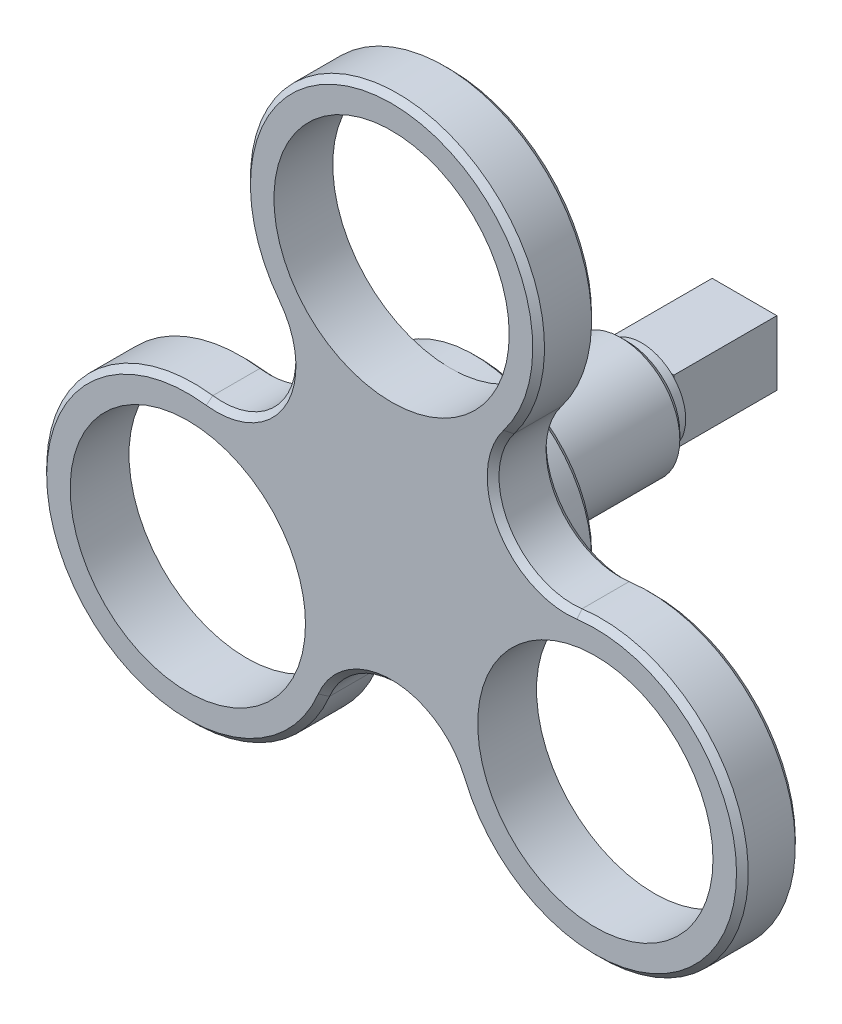
ISO-10303-21;
HEADER;
FILE_DESCRIPTION(('STEP AP214'),'2;1');
FILE_NAME('part.step','',(''),(''),'','','');
FILE_SCHEMA(('AUTOMOTIVE_DESIGN { 1 0 10303 214 1 1 1 1 }'));
ENDSEC;
DATA;
#1=APPLICATION_CONTEXT('core data for automotive mechanical design processes');
#2=APPLICATION_PROTOCOL_DEFINITION('international standard','automotive_design',2000,#1);
#3=PRODUCT_CONTEXT('',#1,'mechanical');
#4=PRODUCT('Part','Part','',(#3));
#5=PRODUCT_RELATED_PRODUCT_CATEGORY('part','',(#4));
#6=PRODUCT_DEFINITION_FORMATION('','',#4);
#7=PRODUCT_DEFINITION_CONTEXT('part definition',#1,'design');
#8=PRODUCT_DEFINITION('design','',#6,#7);
#9=PRODUCT_DEFINITION_SHAPE('','',#8);
#10=(LENGTH_UNIT() NAMED_UNIT(*) SI_UNIT(.MILLI.,.METRE.));
#11=(NAMED_UNIT(*) PLANE_ANGLE_UNIT() SI_UNIT($,.RADIAN.));
#12=(NAMED_UNIT(*) SI_UNIT($,.STERADIAN.) SOLID_ANGLE_UNIT());
#13=UNCERTAINTY_MEASURE_WITH_UNIT(LENGTH_MEASURE(1.E-05),#10,'distance_accuracy_value','');
#14=(GEOMETRIC_REPRESENTATION_CONTEXT(3) GLOBAL_UNCERTAINTY_ASSIGNED_CONTEXT((#13)) GLOBAL_UNIT_ASSIGNED_CONTEXT((#10,
#11,#12)) REPRESENTATION_CONTEXT('',''));
#15=CARTESIAN_POINT('',(0.,0.,0.));
#16=DIRECTION('',(0.,0.,1.));
#17=DIRECTION('',(1.,0.,0.));
#18=AXIS2_PLACEMENT_3D('',#15,#16,#17);
#19=CARTESIAN_POINT('',(0.,0.,3.5));
#20=DIRECTION('',(0.,0.,1.));
#21=DIRECTION('',(1.,0.,0.));
#22=AXIS2_PLACEMENT_3D('',#19,#20,#21);
#23=PLANE('',#22);
#24=CARTESIAN_POINT('',(0.,0.,3.5));
#25=DIRECTION('',(0.,0.,1.));
#26=DIRECTION('',(1.,0.,0.));
#27=AXIS2_PLACEMENT_3D('',#24,#25,#26);
#28=CIRCLE('',#27,1.5);
#29=CARTESIAN_POINT('',(1.1,1.01980390271856,3.5));
#30=VERTEX_POINT('',#29);
#31=CARTESIAN_POINT('',(1.01980390271856,1.1,3.5));
#32=VERTEX_POINT('',#31);
#33=EDGE_CURVE('E228',#30,#32,#28,.T.);
#34=ORIENTED_EDGE('',*,*,#33,.F.);
#35=DIRECTION('',(0.,1.,0.));
#36=VECTOR('',#35,1.);
#37=CARTESIAN_POINT('',(1.1,-1.1,3.5));
#38=LINE('',#37,#36);
#39=CARTESIAN_POINT('',(1.1,1.1,3.5));
#40=VERTEX_POINT('',#39);
#41=EDGE_CURVE('E245',#30,#40,#38,.T.);
#42=ORIENTED_EDGE('',*,*,#41,.T.);
#43=DIRECTION('',(-1.,0.,0.));
#44=VECTOR('',#43,1.);
#45=CARTESIAN_POINT('',(1.1,1.1,3.5));
#46=LINE('',#45,#44);
#47=EDGE_CURVE('E252',#40,#32,#46,.T.);
#48=ORIENTED_EDGE('',*,*,#47,.T.);
#49=EDGE_LOOP('',(#34,#42,#48));
#50=FACE_BOUND('',#49,.T.);
#51=ADVANCED_FACE('F41',(#50),#23,.T.);
#52=CARTESIAN_POINT('',(-1.01980390271856,1.1,3.5));
#53=VERTEX_POINT('',#52);
#54=CARTESIAN_POINT('',(-1.1,1.01980390271856,3.5));
#55=VERTEX_POINT('',#54);
#56=EDGE_CURVE('E289',#53,#55,#28,.T.);
#57=ORIENTED_EDGE('',*,*,#56,.F.);
#58=CARTESIAN_POINT('',(-1.1,1.1,3.5));
#59=VERTEX_POINT('',#58);
#60=EDGE_CURVE('E250',#53,#59,#46,.T.);
#61=ORIENTED_EDGE('',*,*,#60,.T.);
#62=DIRECTION('',(0.,-1.,0.));
#63=VECTOR('',#62,1.);
#64=CARTESIAN_POINT('',(-1.1,-1.1,3.5));
#65=LINE('',#64,#63);
#66=EDGE_CURVE('E234',#59,#55,#65,.T.);
#67=ORIENTED_EDGE('',*,*,#66,.T.);
#68=EDGE_LOOP('',(#57,#61,#67));
#69=FACE_BOUND('',#68,.T.);
#70=ADVANCED_FACE('F524',(#69),#23,.T.);
#71=CARTESIAN_POINT('',(-1.1,-1.01980390271856,3.5));
#72=VERTEX_POINT('',#71);
#73=CARTESIAN_POINT('',(-1.01980390271856,-1.1,3.5));
#74=VERTEX_POINT('',#73);
#75=EDGE_CURVE('E558',#72,#74,#28,.T.);
#76=ORIENTED_EDGE('',*,*,#75,.F.);
#77=CARTESIAN_POINT('',(-1.1,-1.1,3.5));
#78=VERTEX_POINT('',#77);
#79=EDGE_CURVE('E240',#72,#78,#65,.T.);
#80=ORIENTED_EDGE('',*,*,#79,.T.);
#81=DIRECTION('',(1.,0.,0.));
#82=VECTOR('',#81,1.);
#83=CARTESIAN_POINT('',(1.1,-1.1,3.5));
#84=LINE('',#83,#82);
#85=EDGE_CURVE('E241',#78,#74,#84,.T.);
#86=ORIENTED_EDGE('',*,*,#85,.T.);
#87=EDGE_LOOP('',(#76,#80,#86));
#88=FACE_BOUND('',#87,.T.);
#89=ADVANCED_FACE('F531',(#88),#23,.T.);
#90=CARTESIAN_POINT('',(-1.1,-1.1,3.5));
#91=DIRECTION('',(1.,0.,0.));
#92=DIRECTION('',(0.,0.,-1.));
#93=AXIS2_PLACEMENT_3D('',#90,#91,#92);
#94=PLANE('',#93);
#95=DIRECTION('',(0.,-1.,0.));
#96=VECTOR('',#95,1.);
#97=CARTESIAN_POINT('',(-1.1,-1.1,0.));
#98=LINE('',#97,#96);
#99=CARTESIAN_POINT('',(-1.1,1.1,0.));
#100=VERTEX_POINT('',#99);
#101=CARTESIAN_POINT('',(-1.1,-1.1,0.));
#102=VERTEX_POINT('',#101);
#103=EDGE_CURVE('E227',#100,#102,#98,.T.);
#104=ORIENTED_EDGE('',*,*,#103,.T.);
#105=DIRECTION('',(0.,0.,-1.));
#106=VECTOR('',#105,1.);
#107=CARTESIAN_POINT('',(-1.1,-1.1,3.5));
#108=LINE('',#107,#106);
#109=EDGE_CURVE('E281',#78,#102,#108,.T.);
#110=ORIENTED_EDGE('',*,*,#109,.F.);
#111=ORIENTED_EDGE('',*,*,#79,.F.);
#112=EDGE_CURVE('E239',#55,#72,#65,.T.);
#113=ORIENTED_EDGE('',*,*,#112,.F.);
#114=ORIENTED_EDGE('',*,*,#66,.F.);
#115=DIRECTION('',(0.,0.,-1.));
#116=VECTOR('',#115,1.);
#117=CARTESIAN_POINT('',(-1.1,1.1,3.5));
#118=LINE('',#117,#116);
#119=EDGE_CURVE('E256',#59,#100,#118,.T.);
#120=ORIENTED_EDGE('',*,*,#119,.T.);
#121=EDGE_LOOP('',(#104,#110,#111,#113,#114,#120));
#122=FACE_BOUND('',#121,.T.);
#123=ADVANCED_FACE('F549',(#122),#94,.F.);
#124=CARTESIAN_POINT('',(1.1,-1.1,3.5));
#125=DIRECTION('',(0.,1.,0.));
#126=DIRECTION('',(-1.,0.,0.));
#127=AXIS2_PLACEMENT_3D('',#124,#125,#126);
#128=PLANE('',#127);
#129=DIRECTION('',(1.,0.,0.));
#130=VECTOR('',#129,1.);
#131=CARTESIAN_POINT('',(1.1,-1.1,0.));
#132=LINE('',#131,#130);
#133=CARTESIAN_POINT('',(1.1,-1.1,0.));
#134=VERTEX_POINT('',#133);
#135=EDGE_CURVE('E261',#102,#134,#132,.T.);
#136=ORIENTED_EDGE('',*,*,#135,.T.);
#137=DIRECTION('',(0.,0.,-1.));
#138=VECTOR('',#137,1.);
#139=CARTESIAN_POINT('',(1.1,-1.1,3.5));
#140=LINE('',#139,#138);
#141=CARTESIAN_POINT('',(1.1,-1.1,3.5));
#142=VERTEX_POINT('',#141);
#143=EDGE_CURVE('E277',#142,#134,#140,.T.);
#144=ORIENTED_EDGE('',*,*,#143,.F.);
#145=CARTESIAN_POINT('',(1.01980390271856,-1.1,3.5));
#146=VERTEX_POINT('',#145);
#147=EDGE_CURVE('E238',#146,#142,#84,.T.);
#148=ORIENTED_EDGE('',*,*,#147,.F.);
#149=EDGE_CURVE('E246',#74,#146,#84,.T.);
#150=ORIENTED_EDGE('',*,*,#149,.F.);
#151=ORIENTED_EDGE('',*,*,#85,.F.);
#152=ORIENTED_EDGE('',*,*,#109,.T.);
#153=EDGE_LOOP('',(#136,#144,#148,#150,#151,#152));
#154=FACE_BOUND('',#153,.T.);
#155=ADVANCED_FACE('F554',(#154),#128,.F.);
#156=CARTESIAN_POINT('',(1.1,-1.1,3.5));
#157=DIRECTION('',(-1.,0.,0.));
#158=DIRECTION('',(0.,0.,1.));
#159=AXIS2_PLACEMENT_3D('',#156,#157,#158);
#160=PLANE('',#159);
#161=DIRECTION('',(0.,1.,0.));
#162=VECTOR('',#161,1.);
#163=CARTESIAN_POINT('',(1.1,-1.1,0.));
#164=LINE('',#163,#162);
#165=CARTESIAN_POINT('',(1.1,1.1,0.));
#166=VERTEX_POINT('',#165);
#167=EDGE_CURVE('E264',#134,#166,#164,.T.);
#168=ORIENTED_EDGE('',*,*,#167,.T.);
#169=DIRECTION('',(0.,0.,-1.));
#170=VECTOR('',#169,1.);
#171=CARTESIAN_POINT('',(1.1,1.1,3.5));
#172=LINE('',#171,#170);
#173=EDGE_CURVE('E273',#40,#166,#172,.T.);
#174=ORIENTED_EDGE('',*,*,#173,.F.);
#175=ORIENTED_EDGE('',*,*,#41,.F.);
#176=CARTESIAN_POINT('',(1.1,-1.01980390271856,3.5));
#177=VERTEX_POINT('',#176);
#178=EDGE_CURVE('E251',#177,#30,#38,.T.);
#179=ORIENTED_EDGE('',*,*,#178,.F.);
#180=EDGE_CURVE('E247',#142,#177,#38,.T.);
#181=ORIENTED_EDGE('',*,*,#180,.F.);
#182=ORIENTED_EDGE('',*,*,#143,.T.);
#183=EDGE_LOOP('',(#168,#174,#175,#179,#181,#182));
#184=FACE_BOUND('',#183,.T.);
#185=ADVANCED_FACE('F545',(#184),#160,.F.);
#186=CARTESIAN_POINT('',(1.1,1.1,3.5));
#187=DIRECTION('',(0.,-1.,0.));
#188=DIRECTION('',(1.,0.,0.));
#189=AXIS2_PLACEMENT_3D('',#186,#187,#188);
#190=PLANE('',#189);
#191=DIRECTION('',(-1.,0.,0.));
#192=VECTOR('',#191,1.);
#193=CARTESIAN_POINT('',(1.1,1.1,0.));
#194=LINE('',#193,#192);
#195=EDGE_CURVE('E267',#166,#100,#194,.T.);
#196=ORIENTED_EDGE('',*,*,#195,.T.);
#197=ORIENTED_EDGE('',*,*,#119,.F.);
#198=ORIENTED_EDGE('',*,*,#60,.F.);
#199=EDGE_CURVE('E257',#32,#53,#46,.T.);
#200=ORIENTED_EDGE('',*,*,#199,.F.);
#201=ORIENTED_EDGE('',*,*,#47,.F.);
#202=ORIENTED_EDGE('',*,*,#173,.T.);
#203=EDGE_LOOP('',(#196,#197,#198,#200,#201,#202));
#204=FACE_BOUND('',#203,.T.);
#205=ADVANCED_FACE('F537',(#204),#190,.F.);
#206=EDGE_CURVE('E233',#146,#177,#28,.T.);
#207=ORIENTED_EDGE('',*,*,#206,.F.);
#208=ORIENTED_EDGE('',*,*,#147,.T.);
#209=ORIENTED_EDGE('',*,*,#180,.T.);
#210=EDGE_LOOP('',(#207,#208,#209));
#211=FACE_BOUND('',#210,.T.);
#212=ADVANCED_FACE('F527',(#211),#23,.T.);
#213=CARTESIAN_POINT('',(0.,0.,0.));
#214=DIRECTION('',(0.,0.,1.));
#215=DIRECTION('',(1.,0.,0.));
#216=AXIS2_PLACEMENT_3D('',#213,#214,#215);
#217=PLANE('',#216);
#218=ORIENTED_EDGE('',*,*,#103,.F.);
#219=ORIENTED_EDGE('',*,*,#195,.F.);
#220=ORIENTED_EDGE('',*,*,#167,.F.);
#221=ORIENTED_EDGE('',*,*,#135,.F.);
#222=EDGE_LOOP('',(#218,#219,#220,#221));
#223=FACE_BOUND('',#222,.T.);
#224=ADVANCED_FACE('F536',(#223),#217,.F.);
#225=CARTESIAN_POINT('',(0.,0.,3.5));
#226=DIRECTION('',(0.,0.,1.));
#227=DIRECTION('',(1.,0.,0.));
#228=AXIS2_PLACEMENT_3D('',#225,#226,#227);
#229=PLANE('',#228);
#230=EDGE_CURVE('E572',#55,#72,#28,.T.);
#231=ORIENTED_EDGE('',*,*,#230,.F.);
#232=ORIENTED_EDGE('',*,*,#112,.T.);
#233=EDGE_LOOP('',(#231,#232));
#234=FACE_BOUND('',#233,.T.);
#235=ADVANCED_FACE('F543',(#234),#229,.F.);
#236=EDGE_CURVE('E578',#74,#146,#28,.T.);
#237=ORIENTED_EDGE('',*,*,#236,.F.);
#238=ORIENTED_EDGE('',*,*,#149,.T.);
#239=EDGE_LOOP('',(#237,#238));
#240=FACE_BOUND('',#239,.T.);
#241=ADVANCED_FACE('F615',(#240),#229,.F.);
#242=EDGE_CURVE('E222',#177,#30,#28,.T.);
#243=ORIENTED_EDGE('',*,*,#242,.F.);
#244=ORIENTED_EDGE('',*,*,#178,.T.);
#245=EDGE_LOOP('',(#243,#244));
#246=FACE_BOUND('',#245,.T.);
#247=ADVANCED_FACE('F587',(#246),#229,.F.);
#248=EDGE_CURVE('E232',#32,#53,#28,.T.);
#249=ORIENTED_EDGE('',*,*,#248,.F.);
#250=ORIENTED_EDGE('',*,*,#199,.T.);
#251=EDGE_LOOP('',(#249,#250));
#252=FACE_BOUND('',#251,.T.);
#253=ADVANCED_FACE('F622',(#252),#229,.F.);
#254=CARTESIAN_POINT('',(0.,0.,4.));
#255=DIRECTION('',(0.,0.,-1.));
#256=DIRECTION('',(-1.,0.,0.));
#257=AXIS2_PLACEMENT_3D('',#254,#255,#256);
#258=CYLINDRICAL_SURFACE('',#257,1.5);
#259=CARTESIAN_POINT('',(0.,0.,4.));
#260=DIRECTION('',(0.,0.,1.));
#261=DIRECTION('',(1.,0.,0.));
#262=AXIS2_PLACEMENT_3D('',#259,#260,#261);
#263=CIRCLE('',#262,1.5);
#264=CARTESIAN_POINT('',(1.5,0.,4.));
#265=VERTEX_POINT('',#264);
#266=EDGE_CURVE('E223',#265,#265,#263,.T.);
#267=ORIENTED_EDGE('',*,*,#266,.F.);
#268=EDGE_LOOP('',(#267));
#269=FACE_BOUND('',#268,.T.);
#270=ORIENTED_EDGE('',*,*,#33,.T.);
#271=ORIENTED_EDGE('',*,*,#248,.T.);
#272=ORIENTED_EDGE('',*,*,#56,.T.);
#273=ORIENTED_EDGE('',*,*,#230,.T.);
#274=ORIENTED_EDGE('',*,*,#75,.T.);
#275=ORIENTED_EDGE('',*,*,#236,.T.);
#276=ORIENTED_EDGE('',*,*,#206,.T.);
#277=ORIENTED_EDGE('',*,*,#242,.T.);
#278=EDGE_LOOP('',(#270,#271,#272,#273,#274,#275,#276,#277));
#279=FACE_BOUND('',#278,.T.);
#280=ADVANCED_FACE('F575',(#269,#279),#258,.T.);
#281=CARTESIAN_POINT('',(0.,0.,9.));
#282=DIRECTION('',(0.,0.,-1.));
#283=DIRECTION('',(-1.,0.,0.));
#284=AXIS2_PLACEMENT_3D('',#281,#282,#283);
#285=CYLINDRICAL_SURFACE('',#284,2.);
#286=CARTESIAN_POINT('',(0.,0.,4.19999999999999));
#287=DIRECTION('',(0.,0.,1.));
#288=DIRECTION('',(1.,0.,0.));
#289=AXIS2_PLACEMENT_3D('',#286,#287,#288);
#290=CIRCLE('',#289,2.);
#291=CARTESIAN_POINT('',(2.,0.,4.19999999999999));
#292=VERTEX_POINT('',#291);
#293=EDGE_CURVE('E52',#292,#292,#290,.T.);
#294=ORIENTED_EDGE('',*,*,#293,.T.);
#295=EDGE_LOOP('',(#294));
#296=FACE_BOUND('',#295,.T.);
#297=CARTESIAN_POINT('',(0.,0.,9.));
#298=DIRECTION('',(0.,0.,1.));
#299=DIRECTION('',(1.,0.,0.));
#300=AXIS2_PLACEMENT_3D('',#297,#298,#299);
#301=CIRCLE('',#300,2.);
#302=CARTESIAN_POINT('',(2.,0.,9.));
#303=VERTEX_POINT('',#302);
#304=EDGE_CURVE('E202',#303,#303,#301,.T.);
#305=ORIENTED_EDGE('',*,*,#304,.F.);
#306=EDGE_LOOP('',(#305));
#307=FACE_BOUND('',#306,.T.);
#308=ADVANCED_FACE('F624',(#296,#307),#285,.T.);
#309=CARTESIAN_POINT('',(0.,0.,4.));
#310=DIRECTION('',(0.,0.,1.));
#311=DIRECTION('',(1.,0.,0.));
#312=AXIS2_PLACEMENT_3D('',#309,#310,#311);
#313=PLANE('',#312);
#314=CARTESIAN_POINT('',(0.,0.,4.));
#315=DIRECTION('',(0.,0.,1.));
#316=DIRECTION('',(1.,0.,0.));
#317=AXIS2_PLACEMENT_3D('',#314,#315,#316);
#318=CIRCLE('',#317,1.80000000000001);
#319=CARTESIAN_POINT('',(1.80000000000001,0.,4.));
#320=VERTEX_POINT('',#319);
#321=EDGE_CURVE('E11',#320,#320,#318,.F.);
#322=ORIENTED_EDGE('',*,*,#321,.T.);
#323=EDGE_LOOP('',(#322));
#324=FACE_BOUND('',#323,.T.);
#325=ORIENTED_EDGE('',*,*,#266,.T.);
#326=EDGE_LOOP('',(#325));
#327=FACE_BOUND('',#326,.T.);
#328=ADVANCED_FACE('F632',(#324,#327),#313,.F.);
#329=CARTESIAN_POINT('',(0.,0.,10.));
#330=DIRECTION('',(0.,0.,-1.));
#331=DIRECTION('',(-1.,0.,0.));
#332=AXIS2_PLACEMENT_3D('',#329,#330,#331);
#333=CYLINDRICAL_SURFACE('',#332,4.);
#334=CARTESIAN_POINT('',(0.,0.,9.2));
#335=DIRECTION('',(0.,0.,1.));
#336=DIRECTION('',(1.,0.,0.));
#337=AXIS2_PLACEMENT_3D('',#334,#335,#336);
#338=CIRCLE('',#337,4.);
#339=CARTESIAN_POINT('',(4.,0.,9.2));
#340=VERTEX_POINT('',#339);
#341=EDGE_CURVE('E360',#340,#340,#338,.T.);
#342=ORIENTED_EDGE('',*,*,#341,.T.);
#343=EDGE_LOOP('',(#342));
#344=FACE_BOUND('',#343,.T.);
#345=CARTESIAN_POINT('',(0.,0.,10.));
#346=DIRECTION('',(0.,0.,1.));
#347=DIRECTION('',(1.,0.,0.));
#348=AXIS2_PLACEMENT_3D('',#345,#346,#347);
#349=CIRCLE('',#348,4.);
#350=CARTESIAN_POINT('',(0.,4.,10.));
#351=VERTEX_POINT('',#350);
#352=CARTESIAN_POINT('',(-3.46410161513777,-1.99999999999997,10.));
#353=VERTEX_POINT('',#352);
#354=EDGE_CURVE('E192',#351,#353,#349,.T.);
#355=ORIENTED_EDGE('',*,*,#354,.F.);
#356=CARTESIAN_POINT('',(3.46410161513775,-2.00000000000002,10.));
#357=VERTEX_POINT('',#356);
#358=EDGE_CURVE('E195',#357,#351,#349,.T.);
#359=ORIENTED_EDGE('',*,*,#358,.F.);
#360=EDGE_CURVE('E197',#353,#357,#349,.T.);
#361=ORIENTED_EDGE('',*,*,#360,.F.);
#362=EDGE_LOOP('',(#355,#359,#361));
#363=FACE_BOUND('',#362,.T.);
#364=ADVANCED_FACE('F194',(#344,#363),#333,.T.);
#365=CARTESIAN_POINT('',(0.,0.,9.));
#366=DIRECTION('',(0.,0.,1.));
#367=DIRECTION('',(1.,0.,0.));
#368=AXIS2_PLACEMENT_3D('',#365,#366,#367);
#369=PLANE('',#368);
#370=CARTESIAN_POINT('',(0.,0.,9.));
#371=DIRECTION('',(0.,0.,1.));
#372=DIRECTION('',(1.,0.,0.));
#373=AXIS2_PLACEMENT_3D('',#370,#371,#372);
#374=CIRCLE('',#373,3.8);
#375=CARTESIAN_POINT('',(3.8,0.,9.));
#376=VERTEX_POINT('',#375);
#377=EDGE_CURVE('E364',#376,#376,#374,.F.);
#378=ORIENTED_EDGE('',*,*,#377,.T.);
#379=EDGE_LOOP('',(#378));
#380=FACE_BOUND('',#379,.T.);
#381=ORIENTED_EDGE('',*,*,#304,.T.);
#382=EDGE_LOOP('',(#381));
#383=FACE_BOUND('',#382,.T.);
#384=ADVANCED_FACE('F513',(#380,#383),#369,.F.);
#385=CARTESIAN_POINT('',(6.4398867190899,-0.281929669182763,12.));
#386=DIRECTION('',(0.,0.,1.));
#387=DIRECTION('',(1.,0.,0.));
#388=AXIS2_PLACEMENT_3D('',#385,#386,#387);
#389=PLANE('',#388);
#390=CARTESIAN_POINT('',(-6.92820323027555,-3.99999999999994,12.));
#391=DIRECTION('',(0.,0.,1.));
#392=DIRECTION('',(1.,0.,0.));
#393=AXIS2_PLACEMENT_3D('',#390,#391,#392);
#394=CIRCLE('',#393,4.80000000000001);
#395=CARTESIAN_POINT('',(-6.30315809595795,0.7591300234461,12.));
#396=VERTEX_POINT('',#395);
#397=CARTESIAN_POINT('',(-2.49415316289922,-5.83826004689213,12.));
#398=VERTEX_POINT('',#397);
#399=EDGE_CURVE('E295',#396,#398,#394,.T.);
#400=ORIENTED_EDGE('',*,*,#399,.T.);
#401=CARTESIAN_POINT('',(0.,-6.87228132326901,12.));
#402=DIRECTION('',(0.,0.,1.));
#403=DIRECTION('',(1.,0.,0.));
#404=AXIS2_PLACEMENT_3D('',#401,#402,#403);
#405=CIRCLE('',#404,2.69999999999999);
#406=CARTESIAN_POINT('',(2.49415316289915,-5.83826004689219,12.));
#407=VERTEX_POINT('',#406);
#408=EDGE_CURVE('E301',#398,#407,#405,.F.);
#409=ORIENTED_EDGE('',*,*,#408,.T.);
#410=CARTESIAN_POINT('',(6.92820323027549,-4.00000000000003,12.));
#411=DIRECTION('',(0.,0.,1.));
#412=DIRECTION('',(1.,0.,0.));
#413=AXIS2_PLACEMENT_3D('',#410,#411,#412);
#414=CIRCLE('',#413,4.80000000000001);
#415=CARTESIAN_POINT('',(6.30315809595793,0.759130023446087,12.));
#416=VERTEX_POINT('',#415);
#417=EDGE_CURVE('E298',#407,#416,#414,.T.);
#418=ORIENTED_EDGE('',*,*,#417,.T.);
#419=CARTESIAN_POINT('',(5.9515702079043,3.43614066163451,12.));
#420=DIRECTION('',(0.,0.,1.));
#421=DIRECTION('',(1.,0.,0.));
#422=AXIS2_PLACEMENT_3D('',#419,#420,#421);
#423=CIRCLE('',#422,2.7);
#424=CARTESIAN_POINT('',(3.80900493305876,5.07913002344608,12.));
#425=VERTEX_POINT('',#424);
#426=EDGE_CURVE('E292',#416,#425,#423,.F.);
#427=ORIENTED_EDGE('',*,*,#426,.T.);
#428=CARTESIAN_POINT('',(0.,8.,12.));
#429=DIRECTION('',(0.,0.,1.));
#430=DIRECTION('',(1.,0.,0.));
#431=AXIS2_PLACEMENT_3D('',#428,#429,#430);
#432=CIRCLE('',#431,4.80000000000001);
#433=CARTESIAN_POINT('',(-3.80900493305875,5.07913002344608,12.));
#434=VERTEX_POINT('',#433);
#435=EDGE_CURVE('E285',#425,#434,#432,.T.);
#436=ORIENTED_EDGE('',*,*,#435,.T.);
#437=CARTESIAN_POINT('',(-5.9515702079043,3.4361406616345,12.));
#438=DIRECTION('',(0.,0.,1.));
#439=DIRECTION('',(1.,0.,0.));
#440=AXIS2_PLACEMENT_3D('',#437,#438,#439);
#441=CIRCLE('',#440,2.69999999999998);
#442=EDGE_CURVE('E288',#434,#396,#441,.F.);
#443=ORIENTED_EDGE('',*,*,#442,.T.);
#444=EDGE_LOOP('',(#400,#409,#418,#427,#436,#443));
#445=FACE_BOUND('',#444,.T.);
#446=CARTESIAN_POINT('',(6.92820323027549,-4.00000000000003,12.));
#447=DIRECTION('',(0.,0.,1.));
#448=DIRECTION('',(1.,0.,0.));
#449=AXIS2_PLACEMENT_3D('',#446,#447,#448);
#450=CIRCLE('',#449,4.);
#451=CARTESIAN_POINT('',(10.9282032302755,-4.00000000000003,12.));
#452=VERTEX_POINT('',#451);
#453=EDGE_CURVE('E495',#452,#452,#450,.T.);
#454=ORIENTED_EDGE('',*,*,#453,.F.);
#455=EDGE_LOOP('',(#454));
#456=FACE_BOUND('',#455,.T.);
#457=CARTESIAN_POINT('',(0.,8.,12.));
#458=DIRECTION('',(0.,0.,1.));
#459=DIRECTION('',(1.,0.,0.));
#460=AXIS2_PLACEMENT_3D('',#457,#458,#459);
#461=CIRCLE('',#460,4.);
#462=CARTESIAN_POINT('',(4.,8.,12.));
#463=VERTEX_POINT('',#462);
#464=EDGE_CURVE('E489',#463,#463,#461,.T.);
#465=ORIENTED_EDGE('',*,*,#464,.F.);
#466=EDGE_LOOP('',(#465));
#467=FACE_BOUND('',#466,.T.);
#468=CARTESIAN_POINT('',(-6.92820323027555,-3.99999999999994,12.));
#469=DIRECTION('',(0.,0.,1.));
#470=DIRECTION('',(1.,0.,0.));
#471=AXIS2_PLACEMENT_3D('',#468,#469,#470);
#472=CIRCLE('',#471,4.);
#473=CARTESIAN_POINT('',(-2.92820323027555,-3.99999999999994,12.));
#474=VERTEX_POINT('',#473);
#475=EDGE_CURVE('E499',#474,#474,#472,.T.);
#476=ORIENTED_EDGE('',*,*,#475,.F.);
#477=EDGE_LOOP('',(#476));
#478=FACE_BOUND('',#477,.T.);
#479=ADVANCED_FACE('F473',(#445,#456,#467,#478),#389,.T.);
#480=CARTESIAN_POINT('',(6.4398867190899,-0.281929669182763,10.));
#481=DIRECTION('',(0.,0.,1.));
#482=DIRECTION('',(1.,0.,0.));
#483=AXIS2_PLACEMENT_3D('',#480,#481,#482);
#484=PLANE('',#483);
#485=CARTESIAN_POINT('',(6.92820323027549,-4.00000000000003,10.));
#486=DIRECTION('',(0.,0.,1.));
#487=DIRECTION('',(1.,0.,0.));
#488=AXIS2_PLACEMENT_3D('',#485,#486,#487);
#489=CIRCLE('',#488,4.79999999999999);
#490=CARTESIAN_POINT('',(6.30315809595793,0.759130023446073,10.));
#491=VERTEX_POINT('',#490);
#492=CARTESIAN_POINT('',(2.49415316289917,-5.83826004689218,10.));
#493=VERTEX_POINT('',#492);
#494=EDGE_CURVE('E60',#491,#493,#489,.F.);
#495=ORIENTED_EDGE('',*,*,#494,.T.);
#496=CARTESIAN_POINT('',(0.,-6.87228132326901,10.));
#497=DIRECTION('',(0.,0.,1.));
#498=DIRECTION('',(1.,0.,0.));
#499=AXIS2_PLACEMENT_3D('',#496,#497,#498);
#500=CIRCLE('',#499,2.70000000000001);
#501=CARTESIAN_POINT('',(-2.49415316289924,-5.83826004689213,10.));
#502=VERTEX_POINT('',#501);
#503=EDGE_CURVE('E357',#493,#502,#500,.T.);
#504=ORIENTED_EDGE('',*,*,#503,.T.);
#505=CARTESIAN_POINT('',(-6.92820323027555,-3.99999999999994,10.));
#506=DIRECTION('',(0.,0.,1.));
#507=DIRECTION('',(1.,0.,0.));
#508=AXIS2_PLACEMENT_3D('',#505,#506,#507);
#509=CIRCLE('',#508,4.79999999999999);
#510=CARTESIAN_POINT('',(-6.30315809595795,0.759130023446086,10.));
#511=VERTEX_POINT('',#510);
#512=EDGE_CURVE('E352',#502,#511,#509,.F.);
#513=ORIENTED_EDGE('',*,*,#512,.T.);
#514=CARTESIAN_POINT('',(-5.9515702079043,3.4361406616345,10.));
#515=DIRECTION('',(0.,0.,1.));
#516=DIRECTION('',(1.,0.,0.));
#517=AXIS2_PLACEMENT_3D('',#514,#515,#516);
#518=CIRCLE('',#517,2.7);
#519=CARTESIAN_POINT('',(-3.80900493305874,5.07913002344608,10.));
#520=VERTEX_POINT('',#519);
#521=EDGE_CURVE('E346',#511,#520,#518,.T.);
#522=ORIENTED_EDGE('',*,*,#521,.T.);
#523=CARTESIAN_POINT('',(0.,8.,10.));
#524=DIRECTION('',(0.,0.,1.));
#525=DIRECTION('',(1.,0.,0.));
#526=AXIS2_PLACEMENT_3D('',#523,#524,#525);
#527=CIRCLE('',#526,4.79999999999999);
#528=CARTESIAN_POINT('',(3.80900493305875,5.07913002344609,10.));
#529=VERTEX_POINT('',#528);
#530=EDGE_CURVE('E343',#520,#529,#527,.F.);
#531=ORIENTED_EDGE('',*,*,#530,.T.);
#532=CARTESIAN_POINT('',(5.9515702079043,3.43614066163451,10.));
#533=DIRECTION('',(0.,0.,1.));
#534=DIRECTION('',(1.,0.,0.));
#535=AXIS2_PLACEMENT_3D('',#532,#533,#534);
#536=CIRCLE('',#535,2.70000000000001);
#537=EDGE_CURVE('E349',#529,#491,#536,.T.);
#538=ORIENTED_EDGE('',*,*,#537,.T.);
#539=EDGE_LOOP('',(#495,#504,#513,#522,#531,#538));
#540=FACE_BOUND('',#539,.T.);
#541=CARTESIAN_POINT('',(0.,8.,10.));
#542=DIRECTION('',(0.,0.,1.));
#543=DIRECTION('',(1.,0.,0.));
#544=AXIS2_PLACEMENT_3D('',#541,#542,#543);
#545=CIRCLE('',#544,4.);
#546=EDGE_CURVE('E207',#351,#351,#545,.T.);
#547=ORIENTED_EDGE('',*,*,#546,.T.);
#548=ORIENTED_EDGE('',*,*,#354,.T.);
#549=CARTESIAN_POINT('',(-6.92820323027555,-3.99999999999994,10.));
#550=DIRECTION('',(0.,0.,1.));
#551=DIRECTION('',(1.,0.,0.));
#552=AXIS2_PLACEMENT_3D('',#549,#550,#551);
#553=CIRCLE('',#552,4.);
#554=EDGE_CURVE('E393',#353,#353,#553,.T.);
#555=ORIENTED_EDGE('',*,*,#554,.T.);
#556=ORIENTED_EDGE('',*,*,#360,.T.);
#557=CARTESIAN_POINT('',(6.92820323027549,-4.00000000000003,10.));
#558=DIRECTION('',(0.,0.,1.));
#559=DIRECTION('',(1.,0.,0.));
#560=AXIS2_PLACEMENT_3D('',#557,#558,#559);
#561=CIRCLE('',#560,4.);
#562=EDGE_CURVE('E209',#357,#357,#561,.T.);
#563=ORIENTED_EDGE('',*,*,#562,.T.);
#564=ORIENTED_EDGE('',*,*,#358,.T.);
#565=EDGE_LOOP('',(#547,#548,#555,#556,#563,#564));
#566=FACE_BOUND('',#565,.T.);
#567=ADVANCED_FACE('F205',(#540,#566),#484,.F.);
#568=CARTESIAN_POINT('',(5.9515702079043,3.43614066163451,12.));
#569=DIRECTION('',(0.,0.,-1.));
#570=DIRECTION('',(-1.,0.,0.));
#571=AXIS2_PLACEMENT_3D('',#568,#569,#570);
#572=CYLINDRICAL_SURFACE('',#571,2.50000000000001);
#573=DIRECTION('',(0.,0.,-1.));
#574=VECTOR('',#573,1.);
#575=CARTESIAN_POINT('',(3.9677134719362,4.95742710775634,12.));
#576=LINE('',#575,#574);
#577=CARTESIAN_POINT('',(3.9677134719362,4.95742710775634,11.8));
#578=VERTEX_POINT('',#577);
#579=CARTESIAN_POINT('',(3.9677134719362,4.95742710775634,10.2));
#580=VERTEX_POINT('',#579);
#581=EDGE_CURVE('E211',#578,#580,#576,.T.);
#582=ORIENTED_EDGE('',*,*,#581,.F.);
#583=CARTESIAN_POINT('',(5.9515702079043,3.43614066163451,11.8));
#584=DIRECTION('',(0.,0.,1.));
#585=DIRECTION('',(1.,0.,0.));
#586=AXIS2_PLACEMENT_3D('',#583,#584,#585);
#587=CIRCLE('',#586,2.50000000000001);
#588=CARTESIAN_POINT('',(6.2771145486947,0.957427107756305,11.8));
#589=VERTEX_POINT('',#588);
#590=EDGE_CURVE('E328',#578,#589,#587,.T.);
#591=ORIENTED_EDGE('',*,*,#590,.T.);
#592=DIRECTION('',(0.,0.,-1.));
#593=VECTOR('',#592,1.);
#594=CARTESIAN_POINT('',(6.2771145486947,0.957427107756305,12.));
#595=LINE('',#594,#593);
#596=CARTESIAN_POINT('',(6.2771145486947,0.957427107756305,10.2));
#597=VERTEX_POINT('',#596);
#598=EDGE_CURVE('E448',#589,#597,#595,.T.);
#599=ORIENTED_EDGE('',*,*,#598,.T.);
#600=CARTESIAN_POINT('',(5.9515702079043,3.43614066163451,10.2));
#601=DIRECTION('',(0.,0.,1.));
#602=DIRECTION('',(1.,0.,0.));
#603=AXIS2_PLACEMENT_3D('',#600,#601,#602);
#604=CIRCLE('',#603,2.50000000000001);
#605=EDGE_CURVE('E325',#597,#580,#604,.F.);
#606=ORIENTED_EDGE('',*,*,#605,.T.);
#607=EDGE_LOOP('',(#582,#591,#599,#606));
#608=FACE_BOUND('',#607,.T.);
#609=ADVANCED_FACE('F484',(#608),#572,.F.);
#610=CARTESIAN_POINT('',(0.,8.,12.));
#611=DIRECTION('',(0.,0.,-1.));
#612=DIRECTION('',(-1.,0.,0.));
#613=AXIS2_PLACEMENT_3D('',#610,#611,#612);
#614=CYLINDRICAL_SURFACE('',#613,5.);
#615=DIRECTION('',(0.,0.,-1.));
#616=VECTOR('',#615,1.);
#617=CARTESIAN_POINT('',(-3.9677134719362,4.95742710775633,12.));
#618=LINE('',#617,#616);
#619=CARTESIAN_POINT('',(-3.9677134719362,4.95742710775633,11.8));
#620=VERTEX_POINT('',#619);
#621=CARTESIAN_POINT('',(-3.9677134719362,4.95742710775633,10.2));
#622=VERTEX_POINT('',#621);
#623=EDGE_CURVE('E215',#620,#622,#618,.T.);
#624=ORIENTED_EDGE('',*,*,#623,.F.);
#625=CARTESIAN_POINT('',(0.,8.,11.8));
#626=DIRECTION('',(0.,0.,1.));
#627=DIRECTION('',(1.,0.,0.));
#628=AXIS2_PLACEMENT_3D('',#625,#626,#627);
#629=CIRCLE('',#628,5.);
#630=EDGE_CURVE('E340',#620,#578,#629,.F.);
#631=ORIENTED_EDGE('',*,*,#630,.T.);
#632=ORIENTED_EDGE('',*,*,#581,.T.);
#633=CARTESIAN_POINT('',(0.,8.,10.2));
#634=DIRECTION('',(0.,0.,1.));
#635=DIRECTION('',(1.,0.,0.));
#636=AXIS2_PLACEMENT_3D('',#633,#634,#635);
#637=CIRCLE('',#636,5.);
#638=EDGE_CURVE('E337',#580,#622,#637,.T.);
#639=ORIENTED_EDGE('',*,*,#638,.T.);
#640=EDGE_LOOP('',(#624,#631,#632,#639));
#641=FACE_BOUND('',#640,.T.);
#642=ADVANCED_FACE('F459',(#641),#614,.T.);
#643=CARTESIAN_POINT('',(-5.9515702079043,3.4361406616345,12.));
#644=DIRECTION('',(0.,0.,-1.));
#645=DIRECTION('',(-1.,0.,0.));
#646=AXIS2_PLACEMENT_3D('',#643,#644,#645);
#647=CYLINDRICAL_SURFACE('',#646,2.49999999999999);
#648=DIRECTION('',(0.,0.,-1.));
#649=VECTOR('',#648,1.);
#650=CARTESIAN_POINT('',(-6.27711454869472,0.957427107756345,12.));
#651=LINE('',#650,#649);
#652=CARTESIAN_POINT('',(-6.27711454869472,0.957427107756345,11.8));
#653=VERTEX_POINT('',#652);
#654=CARTESIAN_POINT('',(-6.27711454869472,0.957427107756345,10.2));
#655=VERTEX_POINT('',#654);
#656=EDGE_CURVE('E436',#653,#655,#651,.T.);
#657=ORIENTED_EDGE('',*,*,#656,.F.);
#658=CARTESIAN_POINT('',(-5.9515702079043,3.4361406616345,11.8));
#659=DIRECTION('',(0.,0.,1.));
#660=DIRECTION('',(1.,0.,0.));
#661=AXIS2_PLACEMENT_3D('',#658,#659,#660);
#662=CIRCLE('',#661,2.49999999999999);
#663=EDGE_CURVE('E334',#653,#620,#662,.T.);
#664=ORIENTED_EDGE('',*,*,#663,.T.);
#665=ORIENTED_EDGE('',*,*,#623,.T.);
#666=CARTESIAN_POINT('',(-5.9515702079043,3.4361406616345,10.2));
#667=DIRECTION('',(0.,0.,1.));
#668=DIRECTION('',(1.,0.,0.));
#669=AXIS2_PLACEMENT_3D('',#666,#667,#668);
#670=CIRCLE('',#669,2.49999999999999);
#671=EDGE_CURVE('E331',#622,#655,#670,.F.);
#672=ORIENTED_EDGE('',*,*,#671,.T.);
#673=EDGE_LOOP('',(#657,#664,#665,#672));
#674=FACE_BOUND('',#673,.T.);
#675=ADVANCED_FACE('F455',(#674),#647,.F.);
#676=CARTESIAN_POINT('',(-6.92820323027555,-3.99999999999994,12.));
#677=DIRECTION('',(0.,0.,-1.));
#678=DIRECTION('',(-1.,0.,0.));
#679=AXIS2_PLACEMENT_3D('',#676,#677,#678);
#680=CYLINDRICAL_SURFACE('',#679,5.);
#681=DIRECTION('',(0.,0.,-1.));
#682=VECTOR('',#681,1.);
#683=CARTESIAN_POINT('',(-2.30940107675855,-5.91485421551264,12.));
#684=LINE('',#683,#682);
#685=CARTESIAN_POINT('',(-2.30940107675855,-5.91485421551264,11.8));
#686=VERTEX_POINT('',#685);
#687=CARTESIAN_POINT('',(-2.30940107675855,-5.91485421551264,10.2));
#688=VERTEX_POINT('',#687);
#689=EDGE_CURVE('E434',#686,#688,#684,.T.);
#690=ORIENTED_EDGE('',*,*,#689,.F.);
#691=CARTESIAN_POINT('',(-6.92820323027555,-3.99999999999994,11.8));
#692=DIRECTION('',(0.,0.,1.));
#693=DIRECTION('',(1.,0.,0.));
#694=AXIS2_PLACEMENT_3D('',#691,#692,#693);
#695=CIRCLE('',#694,5.);
#696=EDGE_CURVE('E322',#686,#653,#695,.F.);
#697=ORIENTED_EDGE('',*,*,#696,.T.);
#698=ORIENTED_EDGE('',*,*,#656,.T.);
#699=CARTESIAN_POINT('',(-6.92820323027555,-3.99999999999994,10.2));
#700=DIRECTION('',(0.,0.,1.));
#701=DIRECTION('',(1.,0.,0.));
#702=AXIS2_PLACEMENT_3D('',#699,#700,#701);
#703=CIRCLE('',#702,5.);
#704=EDGE_CURVE('E319',#655,#688,#703,.T.);
#705=ORIENTED_EDGE('',*,*,#704,.T.);
#706=EDGE_LOOP('',(#690,#697,#698,#705));
#707=FACE_BOUND('',#706,.T.);
#708=ADVANCED_FACE('F433',(#707),#680,.T.);
#709=CARTESIAN_POINT('',(0.,-6.87228132326901,12.));
#710=DIRECTION('',(0.,0.,-1.));
#711=DIRECTION('',(-1.,0.,0.));
#712=AXIS2_PLACEMENT_3D('',#709,#710,#711);
#713=CYLINDRICAL_SURFACE('',#712,2.5);
#714=DIRECTION('',(0.,0.,-1.));
#715=VECTOR('',#714,1.);
#716=CARTESIAN_POINT('',(2.30940107675851,-5.91485421551268,12.));
#717=LINE('',#716,#715);
#718=CARTESIAN_POINT('',(2.30940107675851,-5.91485421551268,11.8));
#719=VERTEX_POINT('',#718);
#720=CARTESIAN_POINT('',(2.30940107675851,-5.91485421551268,10.2));
#721=VERTEX_POINT('',#720);
#722=EDGE_CURVE('E443',#719,#721,#717,.T.);
#723=ORIENTED_EDGE('',*,*,#722,.F.);
#724=CARTESIAN_POINT('',(0.,-6.87228132326901,11.8));
#725=DIRECTION('',(0.,0.,1.));
#726=DIRECTION('',(1.,0.,0.));
#727=AXIS2_PLACEMENT_3D('',#724,#725,#726);
#728=CIRCLE('',#727,2.5);
#729=EDGE_CURVE('E309',#719,#686,#728,.T.);
#730=ORIENTED_EDGE('',*,*,#729,.T.);
#731=ORIENTED_EDGE('',*,*,#689,.T.);
#732=CARTESIAN_POINT('',(0.,-6.87228132326901,10.2));
#733=DIRECTION('',(0.,0.,1.));
#734=DIRECTION('',(1.,0.,0.));
#735=AXIS2_PLACEMENT_3D('',#732,#733,#734);
#736=CIRCLE('',#735,2.5);
#737=EDGE_CURVE('E305',#688,#721,#736,.F.);
#738=ORIENTED_EDGE('',*,*,#737,.T.);
#739=EDGE_LOOP('',(#723,#730,#731,#738));
#740=FACE_BOUND('',#739,.T.);
#741=ADVANCED_FACE('F439',(#740),#713,.F.);
#742=CARTESIAN_POINT('',(6.92820323027549,-4.00000000000003,12.));
#743=DIRECTION('',(0.,0.,-1.));
#744=DIRECTION('',(-1.,0.,0.));
#745=AXIS2_PLACEMENT_3D('',#742,#743,#744);
#746=CYLINDRICAL_SURFACE('',#745,5.);
#747=ORIENTED_EDGE('',*,*,#598,.F.);
#748=CARTESIAN_POINT('',(6.92820323027549,-4.00000000000003,11.8));
#749=DIRECTION('',(0.,0.,1.));
#750=DIRECTION('',(1.,0.,0.));
#751=AXIS2_PLACEMENT_3D('',#748,#749,#750);
#752=CIRCLE('',#751,5.);
#753=EDGE_CURVE('E316',#589,#719,#752,.F.);
#754=ORIENTED_EDGE('',*,*,#753,.T.);
#755=ORIENTED_EDGE('',*,*,#722,.T.);
#756=CARTESIAN_POINT('',(6.92820323027549,-4.00000000000003,10.2));
#757=DIRECTION('',(0.,0.,1.));
#758=DIRECTION('',(1.,0.,0.));
#759=AXIS2_PLACEMENT_3D('',#756,#757,#758);
#760=CIRCLE('',#759,5.);
#761=EDGE_CURVE('E313',#721,#597,#760,.T.);
#762=ORIENTED_EDGE('',*,*,#761,.T.);
#763=EDGE_LOOP('',(#747,#754,#755,#762));
#764=FACE_BOUND('',#763,.T.);
#765=ADVANCED_FACE('F486',(#764),#746,.T.);
#766=CARTESIAN_POINT('',(0.,8.,12.));
#767=DIRECTION('',(0.,0.,-1.));
#768=DIRECTION('',(-1.,0.,0.));
#769=AXIS2_PLACEMENT_3D('',#766,#767,#768);
#770=CYLINDRICAL_SURFACE('',#769,4.);
#771=ORIENTED_EDGE('',*,*,#464,.T.);
#772=EDGE_LOOP('',(#771));
#773=FACE_BOUND('',#772,.T.);
#774=ORIENTED_EDGE('',*,*,#546,.F.);
#775=EDGE_LOOP('',(#774));
#776=FACE_BOUND('',#775,.T.);
#777=ADVANCED_FACE('F655',(#773,#776),#770,.F.);
#778=CARTESIAN_POINT('',(6.92820323027549,-4.00000000000003,12.));
#779=DIRECTION('',(0.,0.,-1.));
#780=DIRECTION('',(-1.,0.,0.));
#781=AXIS2_PLACEMENT_3D('',#778,#779,#780);
#782=CYLINDRICAL_SURFACE('',#781,4.);
#783=ORIENTED_EDGE('',*,*,#453,.T.);
#784=EDGE_LOOP('',(#783));
#785=FACE_BOUND('',#784,.T.);
#786=ORIENTED_EDGE('',*,*,#562,.F.);
#787=EDGE_LOOP('',(#786));
#788=FACE_BOUND('',#787,.T.);
#789=ADVANCED_FACE('F659',(#785,#788),#782,.F.);
#790=CARTESIAN_POINT('',(-6.92820323027555,-3.99999999999994,12.));
#791=DIRECTION('',(0.,0.,-1.));
#792=DIRECTION('',(-1.,0.,0.));
#793=AXIS2_PLACEMENT_3D('',#790,#791,#792);
#794=CYLINDRICAL_SURFACE('',#793,4.);
#795=ORIENTED_EDGE('',*,*,#475,.T.);
#796=EDGE_LOOP('',(#795));
#797=FACE_BOUND('',#796,.T.);
#798=ORIENTED_EDGE('',*,*,#554,.F.);
#799=EDGE_LOOP('',(#798));
#800=FACE_BOUND('',#799,.T.);
#801=ADVANCED_FACE('F509',(#797,#800),#794,.F.);
#802=CARTESIAN_POINT('',(0.,8.,12.));
#803=DIRECTION('',(0.,0.,-1.));
#804=DIRECTION('',(-1.,0.,0.));
#805=AXIS2_PLACEMENT_3D('',#802,#803,#804);
#806=CONICAL_SURFACE('',#805,4.80000000000001,0.785398163397448);
#807=DIRECTION('',(-0.561119420362262,0.430284784871972,0.707106781186547));
#808=VECTOR('',#807,1.);
#809=CARTESIAN_POINT('',(3.9677134719362,4.95742710775634,11.8));
#810=LINE('',#809,#808);
#811=EDGE_CURVE('E385',#578,#425,#810,.T.);
#812=ORIENTED_EDGE('',*,*,#811,.F.);
#813=ORIENTED_EDGE('',*,*,#630,.F.);
#814=DIRECTION('',(-0.561119420362262,-0.43028478487197,-0.707106781186549));
#815=VECTOR('',#814,1.);
#816=CARTESIAN_POINT('',(-3.80900493305875,5.07913002344608,12.));
#817=LINE('',#816,#815);
#818=EDGE_CURVE('E389',#434,#620,#817,.T.);
#819=ORIENTED_EDGE('',*,*,#818,.F.);
#820=ORIENTED_EDGE('',*,*,#435,.F.);
#821=EDGE_LOOP('',(#812,#813,#819,#820));
#822=FACE_BOUND('',#821,.T.);
#823=ADVANCED_FACE('F464',(#822),#806,.T.);
#824=CARTESIAN_POINT('',(-5.9515702079043,3.4361406616345,12.));
#825=DIRECTION('',(0.,0.,1.));
#826=DIRECTION('',(1.,0.,0.));
#827=AXIS2_PLACEMENT_3D('',#824,#825,#826);
#828=CONICAL_SURFACE('',#827,2.69999999999998,0.785398163397448);
#829=ORIENTED_EDGE('',*,*,#818,.T.);
#830=ORIENTED_EDGE('',*,*,#663,.F.);
#831=DIRECTION('',(0.0920778443799224,0.701086065026503,-0.707106781186548));
#832=VECTOR('',#831,1.);
#833=CARTESIAN_POINT('',(-6.30315809595795,0.7591300234461,12.));
#834=LINE('',#833,#832);
#835=EDGE_CURVE('E381',#396,#653,#834,.T.);
#836=ORIENTED_EDGE('',*,*,#835,.F.);
#837=ORIENTED_EDGE('',*,*,#442,.F.);
#838=EDGE_LOOP('',(#829,#830,#836,#837));
#839=FACE_BOUND('',#838,.T.);
#840=ADVANCED_FACE('F469',(#839),#828,.F.);
#841=CARTESIAN_POINT('',(5.9515702079043,3.43614066163451,12.));
#842=DIRECTION('',(0.,0.,1.));
#843=DIRECTION('',(1.,0.,0.));
#844=AXIS2_PLACEMENT_3D('',#841,#842,#843);
#845=CONICAL_SURFACE('',#844,2.7,0.785398163397448);
#846=ORIENTED_EDGE('',*,*,#811,.T.);
#847=ORIENTED_EDGE('',*,*,#426,.F.);
#848=DIRECTION('',(0.0920778443799162,-0.701086065026504,0.707106781186548));
#849=VECTOR('',#848,1.);
#850=CARTESIAN_POINT('',(6.2771145486947,0.957427107756332,11.8));
#851=LINE('',#850,#849);
#852=EDGE_CURVE('E377',#589,#416,#851,.T.);
#853=ORIENTED_EDGE('',*,*,#852,.F.);
#854=ORIENTED_EDGE('',*,*,#590,.F.);
#855=EDGE_LOOP('',(#846,#847,#853,#854));
#856=FACE_BOUND('',#855,.T.);
#857=ADVANCED_FACE('F478',(#856),#845,.F.);
#858=CARTESIAN_POINT('',(-6.92820323027555,-3.99999999999994,12.));
#859=DIRECTION('',(0.,0.,-1.));
#860=DIRECTION('',(-1.,0.,0.));
#861=AXIS2_PLACEMENT_3D('',#858,#859,#860);
#862=CONICAL_SURFACE('',#861,4.80000000000001,0.785398163397446);
#863=ORIENTED_EDGE('',*,*,#835,.T.);
#864=ORIENTED_EDGE('',*,*,#696,.F.);
#865=DIRECTION('',(0.653197264742177,-0.270801280154536,-0.707106781186549));
#866=VECTOR('',#865,1.);
#867=CARTESIAN_POINT('',(-2.49415316289922,-5.83826004689213,12.));
#868=LINE('',#867,#866);
#869=EDGE_CURVE('E374',#398,#686,#868,.T.);
#870=ORIENTED_EDGE('',*,*,#869,.F.);
#871=ORIENTED_EDGE('',*,*,#399,.F.);
#872=EDGE_LOOP('',(#863,#864,#870,#871));
#873=FACE_BOUND('',#872,.T.);
#874=ADVANCED_FACE('F798',(#873),#862,.T.);
#875=CARTESIAN_POINT('',(6.92820323027549,-4.00000000000003,12.));
#876=DIRECTION('',(0.,0.,-1.));
#877=DIRECTION('',(-1.,0.,0.));
#878=AXIS2_PLACEMENT_3D('',#875,#876,#877);
#879=CONICAL_SURFACE('',#878,4.80000000000001,0.785398163397448);
#880=ORIENTED_EDGE('',*,*,#852,.T.);
#881=ORIENTED_EDGE('',*,*,#417,.F.);
#882=DIRECTION('',(0.65319726474218,0.27080128015453,0.707106781186549));
#883=VECTOR('',#882,1.);
#884=CARTESIAN_POINT('',(2.30940107675848,-5.91485421551269,11.8));
#885=LINE('',#884,#883);
#886=EDGE_CURVE('E371',#719,#407,#885,.T.);
#887=ORIENTED_EDGE('',*,*,#886,.F.);
#888=ORIENTED_EDGE('',*,*,#753,.F.);
#889=EDGE_LOOP('',(#880,#881,#887,#888));
#890=FACE_BOUND('',#889,.T.);
#891=ADVANCED_FACE('F788',(#890),#879,.T.);
#892=CARTESIAN_POINT('',(0.,-6.87228132326901,12.));
#893=DIRECTION('',(0.,0.,1.));
#894=DIRECTION('',(1.,0.,0.));
#895=AXIS2_PLACEMENT_3D('',#892,#893,#894);
#896=CONICAL_SURFACE('',#895,2.69999999999999,0.785398163397448);
#897=ORIENTED_EDGE('',*,*,#869,.T.);
#898=ORIENTED_EDGE('',*,*,#729,.F.);
#899=ORIENTED_EDGE('',*,*,#886,.T.);
#900=ORIENTED_EDGE('',*,*,#408,.F.);
#901=EDGE_LOOP('',(#897,#898,#899,#900));
#902=FACE_BOUND('',#901,.T.);
#903=ADVANCED_FACE('F719',(#902),#896,.F.);
#904=CARTESIAN_POINT('',(0.,8.,10.2));
#905=DIRECTION('',(0.,0.,1.));
#906=DIRECTION('',(1.,0.,0.));
#907=AXIS2_PLACEMENT_3D('',#904,#905,#906);
#908=CONICAL_SURFACE('',#907,5.,0.785398163397448);
#909=DIRECTION('',(0.561119420362262,-0.430284784871975,0.707106781186546));
#910=VECTOR('',#909,1.);
#911=CARTESIAN_POINT('',(3.80900493305875,5.07913002344609,10.));
#912=LINE('',#911,#910);
#913=EDGE_CURVE('E406',#529,#580,#912,.T.);
#914=ORIENTED_EDGE('',*,*,#913,.F.);
#915=ORIENTED_EDGE('',*,*,#530,.F.);
#916=DIRECTION('',(0.561119420362261,0.43028478487197,-0.707106781186549));
#917=VECTOR('',#916,1.);
#918=CARTESIAN_POINT('',(-3.9677134719362,4.95742710775633,10.2));
#919=LINE('',#918,#917);
#920=EDGE_CURVE('E46',#622,#520,#919,.T.);
#921=ORIENTED_EDGE('',*,*,#920,.F.);
#922=ORIENTED_EDGE('',*,*,#638,.F.);
#923=EDGE_LOOP('',(#914,#915,#921,#922));
#924=FACE_BOUND('',#923,.T.);
#925=ADVANCED_FACE('F424',(#924),#908,.T.);
#926=CARTESIAN_POINT('',(-5.9515702079043,3.4361406616345,10.2));
#927=DIRECTION('',(0.,0.,-1.));
#928=DIRECTION('',(-1.,0.,0.));
#929=AXIS2_PLACEMENT_3D('',#926,#927,#928);
#930=CONICAL_SURFACE('',#929,2.49999999999999,0.785398163397447);
#931=ORIENTED_EDGE('',*,*,#920,.T.);
#932=ORIENTED_EDGE('',*,*,#521,.F.);
#933=DIRECTION('',(-0.0920778443799222,-0.701086065026503,-0.707106781186548));
#934=VECTOR('',#933,1.);
#935=CARTESIAN_POINT('',(-6.27711454869472,0.957427107756345,10.2));
#936=LINE('',#935,#934);
#937=EDGE_CURVE('E403',#655,#511,#936,.T.);
#938=ORIENTED_EDGE('',*,*,#937,.F.);
#939=ORIENTED_EDGE('',*,*,#671,.F.);
#940=EDGE_LOOP('',(#931,#932,#938,#939));
#941=FACE_BOUND('',#940,.T.);
#942=ADVANCED_FACE('F419',(#941),#930,.F.);
#943=CARTESIAN_POINT('',(5.9515702079043,3.43614066163451,10.2));
#944=DIRECTION('',(0.,0.,-1.));
#945=DIRECTION('',(-1.,0.,0.));
#946=AXIS2_PLACEMENT_3D('',#943,#944,#945);
#947=CONICAL_SURFACE('',#946,2.50000000000001,0.785398163397447);
#948=ORIENTED_EDGE('',*,*,#913,.T.);
#949=ORIENTED_EDGE('',*,*,#605,.F.);
#950=DIRECTION('',(-0.0920778443799161,0.701086065026504,0.707106781186548));
#951=VECTOR('',#950,1.);
#952=CARTESIAN_POINT('',(6.30315809595793,0.759130023446073,10.));
#953=LINE('',#952,#951);
#954=EDGE_CURVE('E399',#491,#597,#953,.T.);
#955=ORIENTED_EDGE('',*,*,#954,.F.);
#956=ORIENTED_EDGE('',*,*,#537,.F.);
#957=EDGE_LOOP('',(#948,#949,#955,#956));
#958=FACE_BOUND('',#957,.T.);
#959=ADVANCED_FACE('F704',(#958),#947,.F.);
#960=CARTESIAN_POINT('',(-6.92820323027555,-3.99999999999994,10.2));
#961=DIRECTION('',(0.,0.,1.));
#962=DIRECTION('',(1.,0.,0.));
#963=AXIS2_PLACEMENT_3D('',#960,#961,#962);
#964=CONICAL_SURFACE('',#963,5.,0.785398163397446);
#965=ORIENTED_EDGE('',*,*,#937,.T.);
#966=ORIENTED_EDGE('',*,*,#512,.F.);
#967=DIRECTION('',(-0.653197264742178,0.270801280154535,-0.707106781186549));
#968=VECTOR('',#967,1.);
#969=CARTESIAN_POINT('',(-2.30940107675855,-5.91485421551264,10.2));
#970=LINE('',#969,#968);
#971=EDGE_CURVE('E67',#688,#502,#970,.T.);
#972=ORIENTED_EDGE('',*,*,#971,.F.);
#973=ORIENTED_EDGE('',*,*,#704,.F.);
#974=EDGE_LOOP('',(#965,#966,#972,#973));
#975=FACE_BOUND('',#974,.T.);
#976=ADVANCED_FACE('F427',(#975),#964,.T.);
#977=CARTESIAN_POINT('',(6.92820323027549,-4.00000000000003,10.2));
#978=DIRECTION('',(0.,0.,1.));
#979=DIRECTION('',(1.,0.,0.));
#980=AXIS2_PLACEMENT_3D('',#977,#978,#979);
#981=CONICAL_SURFACE('',#980,5.,0.78539816339745);
#982=ORIENTED_EDGE('',*,*,#954,.T.);
#983=ORIENTED_EDGE('',*,*,#761,.F.);
#984=DIRECTION('',(-0.653197264742184,-0.270801280154531,0.707106781186545));
#985=VECTOR('',#984,1.);
#986=CARTESIAN_POINT('',(2.49415316289917,-5.83826004689218,10.));
#987=LINE('',#986,#985);
#988=EDGE_CURVE('E394',#493,#721,#987,.T.);
#989=ORIENTED_EDGE('',*,*,#988,.F.);
#990=ORIENTED_EDGE('',*,*,#494,.F.);
#991=EDGE_LOOP('',(#982,#983,#989,#990));
#992=FACE_BOUND('',#991,.T.);
#993=ADVANCED_FACE('F692',(#992),#981,.T.);
#994=CARTESIAN_POINT('',(0.,-6.87228132326901,10.2));
#995=DIRECTION('',(0.,0.,-1.));
#996=DIRECTION('',(-1.,0.,0.));
#997=AXIS2_PLACEMENT_3D('',#994,#995,#996);
#998=CONICAL_SURFACE('',#997,2.5,0.785398163397448);
#999=ORIENTED_EDGE('',*,*,#971,.T.);
#1000=ORIENTED_EDGE('',*,*,#503,.F.);
#1001=ORIENTED_EDGE('',*,*,#988,.T.);
#1002=ORIENTED_EDGE('',*,*,#737,.F.);
#1003=EDGE_LOOP('',(#999,#1000,#1001,#1002));
#1004=FACE_BOUND('',#1003,.T.);
#1005=ADVANCED_FACE('F684',(#1004),#998,.F.);
#1006=CARTESIAN_POINT('',(0.,0.,9.2));
#1007=DIRECTION('',(0.,0.,1.));
#1008=DIRECTION('',(1.,0.,0.));
#1009=AXIS2_PLACEMENT_3D('',#1006,#1007,#1008);
#1010=CONICAL_SURFACE('',#1009,4.,0.78539816339744);
#1011=ORIENTED_EDGE('',*,*,#377,.F.);
#1012=EDGE_LOOP('',(#1011));
#1013=FACE_BOUND('',#1012,.T.);
#1014=ORIENTED_EDGE('',*,*,#341,.F.);
#1015=EDGE_LOOP('',(#1014));
#1016=FACE_BOUND('',#1015,.T.);
#1017=ADVANCED_FACE('F691',(#1013,#1016),#1010,.T.);
#1018=CARTESIAN_POINT('',(0.,0.,4.19999999999999));
#1019=DIRECTION('',(0.,0.,1.));
#1020=DIRECTION('',(1.,0.,0.));
#1021=AXIS2_PLACEMENT_3D('',#1018,#1019,#1020);
#1022=CONICAL_SURFACE('',#1021,2.,0.78539816339744);
#1023=CARTESIAN_POINT('',(1.80000000000001,0.,4.));
#1024=CARTESIAN_POINT('',(1.80208333333334,0.,4.00208333333333));
#1025=CARTESIAN_POINT('',(1.80416666666668,0.,4.00416666666667));
#1026=CARTESIAN_POINT('',(1.80833333333334,0.,4.00833333333333));
#1027=CARTESIAN_POINT('',(1.81041666666668,0.,4.01041666666667));
#1028=CARTESIAN_POINT('',(1.81458333333334,0.,4.01458333333333));
#1029=CARTESIAN_POINT('',(1.81666666666668,0.,4.01666666666667));
#1030=CARTESIAN_POINT('',(1.82083333333334,0.,4.02083333333333));
#1031=CARTESIAN_POINT('',(1.82291666666667,0.,4.02291666666667));
#1032=CARTESIAN_POINT('',(1.82708333333334,0.,4.02708333333333));
#1033=CARTESIAN_POINT('',(1.82916666666667,0.,4.02916666666667));
#1034=CARTESIAN_POINT('',(1.83333333333334,0.,4.03333333333333));
#1035=CARTESIAN_POINT('',(1.83541666666667,0.,4.03541666666667));
#1036=CARTESIAN_POINT('',(1.83958333333334,0.,4.03958333333333));
#1037=CARTESIAN_POINT('',(1.84166666666667,0.,4.04166666666667));
#1038=CARTESIAN_POINT('',(1.84583333333334,0.,4.04583333333333));
#1039=CARTESIAN_POINT('',(1.84791666666667,0.,4.04791666666666));
#1040=CARTESIAN_POINT('',(1.85208333333334,0.,4.05208333333333));
#1041=CARTESIAN_POINT('',(1.85416666666667,0.,4.05416666666667));
#1042=CARTESIAN_POINT('',(1.85833333333334,0.,4.05833333333333));
#1043=CARTESIAN_POINT('',(1.86041666666667,0.,4.06041666666666));
#1044=CARTESIAN_POINT('',(1.86458333333334,0.,4.06458333333333));
#1045=CARTESIAN_POINT('',(1.86666666666667,0.,4.06666666666666));
#1046=CARTESIAN_POINT('',(1.87083333333334,0.,4.07083333333333));
#1047=CARTESIAN_POINT('',(1.87291666666667,0.,4.07291666666666));
#1048=CARTESIAN_POINT('',(1.87708333333334,0.,4.07708333333333));
#1049=CARTESIAN_POINT('',(1.87916666666667,0.,4.07916666666666));
#1050=CARTESIAN_POINT('',(1.88333333333334,0.,4.08333333333333));
#1051=CARTESIAN_POINT('',(1.88541666666667,0.,4.08541666666666));
#1052=CARTESIAN_POINT('',(1.88958333333334,0.,4.08958333333333));
#1053=CARTESIAN_POINT('',(1.89166666666667,0.,4.09166666666666));
#1054=CARTESIAN_POINT('',(1.89583333333334,0.,4.09583333333333));
#1055=CARTESIAN_POINT('',(1.89791666666667,0.,4.09791666666666));
#1056=CARTESIAN_POINT('',(1.90208333333334,0.,4.10208333333333));
#1057=CARTESIAN_POINT('',(1.90416666666667,0.,4.10416666666666));
#1058=CARTESIAN_POINT('',(1.90833333333334,0.,4.10833333333333));
#1059=CARTESIAN_POINT('',(1.91041666666667,0.,4.11041666666666));
#1060=CARTESIAN_POINT('',(1.91458333333334,0.,4.11458333333333));
#1061=CARTESIAN_POINT('',(1.91666666666667,0.,4.11666666666666));
#1062=CARTESIAN_POINT('',(1.92083333333334,0.,4.12083333333333));
#1063=CARTESIAN_POINT('',(1.92291666666667,0.,4.12291666666666));
#1064=CARTESIAN_POINT('',(1.92708333333334,0.,4.12708333333333));
#1065=CARTESIAN_POINT('',(1.92916666666667,0.,4.12916666666666));
#1066=CARTESIAN_POINT('',(1.93333333333334,0.,4.13333333333333));
#1067=CARTESIAN_POINT('',(1.93541666666667,0.,4.13541666666666));
#1068=CARTESIAN_POINT('',(1.93958333333334,0.,4.13958333333333));
#1069=CARTESIAN_POINT('',(1.94166666666667,0.,4.14166666666666));
#1070=CARTESIAN_POINT('',(1.94583333333334,0.,4.14583333333333));
#1071=CARTESIAN_POINT('',(1.94791666666667,0.,4.14791666666666));
#1072=CARTESIAN_POINT('',(1.95208333333334,0.,4.15208333333333));
#1073=CARTESIAN_POINT('',(1.95416666666667,0.,4.15416666666666));
#1074=CARTESIAN_POINT('',(1.95833333333334,0.,4.15833333333333));
#1075=CARTESIAN_POINT('',(1.96041666666667,0.,4.16041666666666));
#1076=CARTESIAN_POINT('',(1.96458333333333,0.,4.16458333333333));
#1077=CARTESIAN_POINT('',(1.96666666666667,0.,4.16666666666666));
#1078=CARTESIAN_POINT('',(1.97083333333333,0.,4.17083333333333));
#1079=CARTESIAN_POINT('',(1.97291666666667,0.,4.17291666666666));
#1080=CARTESIAN_POINT('',(1.97708333333333,0.,4.17708333333333));
#1081=CARTESIAN_POINT('',(1.97916666666667,0.,4.17916666666666));
#1082=CARTESIAN_POINT('',(1.98333333333333,0.,4.18333333333333));
#1083=CARTESIAN_POINT('',(1.98541666666667,0.,4.18541666666666));
#1084=CARTESIAN_POINT('',(1.98958333333333,0.,4.18958333333333));
#1085=CARTESIAN_POINT('',(1.99166666666667,0.,4.19166666666666));
#1086=CARTESIAN_POINT('',(1.99583333333333,0.,4.19583333333333));
#1087=CARTESIAN_POINT('',(1.99791666666667,0.,4.19791666666666));
#1088=CARTESIAN_POINT('',(2.,0.,4.19999999999999));
#1089=B_SPLINE_CURVE_WITH_KNOTS('',3,(#1023,#1024,#1025,#1026,#1027,#1028,#1029,#1030,#1031,
#1032,#1033,#1034,#1035,#1036,#1037,#1038,#1039,#1040,#1041,#1042,#1043,#1044,#1045,#1046,#1047,
#1048,#1049,#1050,#1051,#1052,#1053,#1054,#1055,#1056,#1057,#1058,#1059,#1060,#1061,#1062,#1063,
#1064,#1065,#1066,#1067,#1068,#1069,#1070,#1071,#1072,#1073,#1074,#1075,#1076,#1077,#1078,#1079,
#1080,#1081,#1082,#1083,#1084,#1085,#1086,#1087,#1088),.UNSPECIFIED.,.F.,.F.,(4,2,2,2,2,2,2,2,2,
2,2,2,2,2,2,2,2,2,2,2,2,2,2,2,2,2,2,2,2,2,2,2,4),(0.,0.00883883476483179,0.0176776695296634,
0.0265165042944946,0.0353553390593264,0.0441941738241574,0.0530330085889892,0.0618718433538204,
0.0707106781186522,0.079549512883484,0.088388347648315,0.0972271824131468,0.106066017177978,
0.11490485194281,0.123743686707641,0.132582521472473,0.141421356237304,0.150260191002136,
0.159099025766967,0.167937860531798,0.17677669529663,0.185615530061461,0.194454364826293,
0.203293199591124,0.212132034355956,0.220970869120788,0.229809703885619,0.238648538650451,
0.247487373415282,0.256326208180113,0.265165042944945,0.274003877709776,0.282842712474608),.UNSPECIFIED.);
#1090=EDGE_CURVE('BSEAM44',#320,#292,#1089,.T.);
#1091=ORIENTED_EDGE('',*,*,#321,.F.);
#1092=ORIENTED_EDGE('',*,*,#293,.F.);
#1093=ORIENTED_EDGE('',*,*,#1090,.T.);
#1094=ORIENTED_EDGE('',*,*,#1090,.F.);
#1095=EDGE_LOOP('',(#1091,#1093,#1092,#1094));
#1096=FACE_BOUND('',#1095,.T.);
#1097=ADVANCED_FACE('F44',(#1096),#1022,.T.);
#1098=CLOSED_SHELL('',(#51,#70,#89,#123,#155,#185,#205,#212,#224,#235,#241,#247,#253,#280,#308,
#328,#364,#384,#479,#567,#609,#642,#675,#708,#741,#765,#777,#789,#801,#823,#840,#857,#874,#891,
#903,#925,#942,#959,#976,#993,#1005,#1017,#1097));
#1099=MANIFOLD_SOLID_BREP('B2',#1098);
#1100=ADVANCED_BREP_SHAPE_REPRESENTATION('',(#18,#1099),#14);
#1101=SHAPE_DEFINITION_REPRESENTATION(#9,#1100);
ENDSEC;
END-ISO-10303-21;
